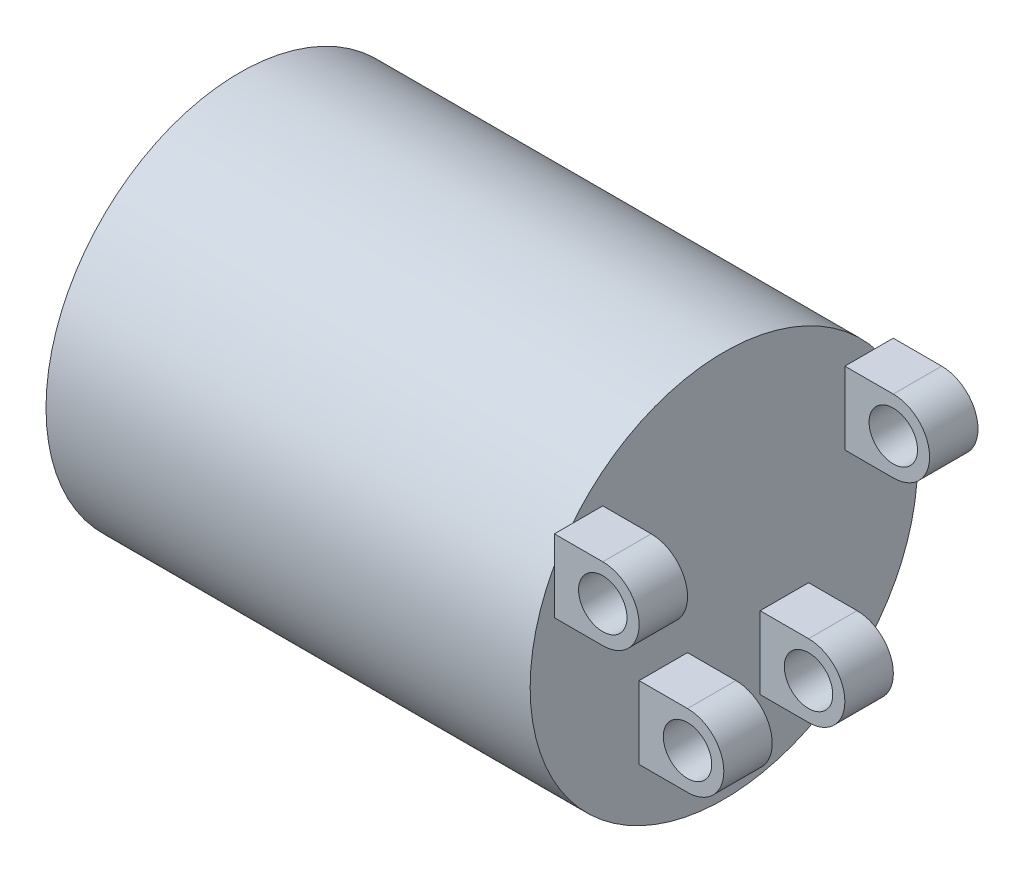
ISO-10303-21;
HEADER;
FILE_DESCRIPTION(('STEP AP214'),'2;1');
FILE_NAME('part.step','',(''),(''),'','','');
FILE_SCHEMA(('AUTOMOTIVE_DESIGN { 1 0 10303 214 1 1 1 1 }'));
ENDSEC;
DATA;
#1=APPLICATION_CONTEXT('core data for automotive mechanical design processes');
#2=APPLICATION_PROTOCOL_DEFINITION('international standard','automotive_design',2000,#1);
#3=PRODUCT_CONTEXT('',#1,'mechanical');
#4=PRODUCT('Part','Part','',(#3));
#5=PRODUCT_RELATED_PRODUCT_CATEGORY('part','',(#4));
#6=PRODUCT_DEFINITION_FORMATION('','',#4);
#7=PRODUCT_DEFINITION_CONTEXT('part definition',#1,'design');
#8=PRODUCT_DEFINITION('design','',#6,#7);
#9=PRODUCT_DEFINITION_SHAPE('','',#8);
#10=(LENGTH_UNIT() NAMED_UNIT(*) SI_UNIT(.MILLI.,.METRE.));
#11=(NAMED_UNIT(*) PLANE_ANGLE_UNIT() SI_UNIT($,.RADIAN.));
#12=(NAMED_UNIT(*) SI_UNIT($,.STERADIAN.) SOLID_ANGLE_UNIT());
#13=UNCERTAINTY_MEASURE_WITH_UNIT(LENGTH_MEASURE(1.E-05),#10,'distance_accuracy_value','');
#14=(GEOMETRIC_REPRESENTATION_CONTEXT(3) GLOBAL_UNCERTAINTY_ASSIGNED_CONTEXT((#13)) GLOBAL_UNIT_ASSIGNED_CONTEXT((#10,
#11,#12)) REPRESENTATION_CONTEXT('',''));
#15=CARTESIAN_POINT('',(0.,0.,0.));
#16=DIRECTION('',(0.,0.,1.));
#17=DIRECTION('',(1.,0.,0.));
#18=AXIS2_PLACEMENT_3D('',#15,#16,#17);
#19=CARTESIAN_POINT('',(60.,0.,-35.));
#20=DIRECTION('',(0.,0.,-1.));
#21=DIRECTION('',(-1.,0.,0.));
#22=AXIS2_PLACEMENT_3D('',#19,#20,#21);
#23=PLANE('',#22);
#24=CARTESIAN_POINT('',(60.,17.4999999999966,-35.));
#25=DIRECTION('',(0.,0.,-1.));
#26=DIRECTION('',(-1.,0.,0.));
#27=AXIS2_PLACEMENT_3D('',#24,#25,#26);
#28=CIRCLE('',#27,5.);
#29=CARTESIAN_POINT('',(55.,17.4999999999966,-35.));
#30=VERTEX_POINT('',#29);
#31=EDGE_CURVE('E210',#30,#30,#28,.T.);
#32=ORIENTED_EDGE('',*,*,#31,.F.);
#33=EDGE_LOOP('',(#32));
#34=FACE_BOUND('',#33,.T.);
#35=DIRECTION('',(-1.,0.,0.));
#36=VECTOR('',#35,1.);
#37=CARTESIAN_POINT('',(60.,25.,-35.));
#38=LINE('',#37,#36);
#39=CARTESIAN_POINT('',(60.,25.,-35.));
#40=VERTEX_POINT('',#39);
#41=CARTESIAN_POINT('',(50.,25.,-35.));
#42=VERTEX_POINT('',#41);
#43=EDGE_CURVE('E169',#40,#42,#38,.T.);
#44=ORIENTED_EDGE('',*,*,#43,.F.);
#45=CARTESIAN_POINT('',(60.,17.5,-35.));
#46=DIRECTION('',(0.,0.,1.));
#47=DIRECTION('',(1.,0.,0.));
#48=AXIS2_PLACEMENT_3D('',#45,#46,#47);
#49=CIRCLE('',#48,7.5);
#50=CARTESIAN_POINT('',(60.,10.,-35.));
#51=VERTEX_POINT('',#50);
#52=EDGE_CURVE('E200',#51,#40,#49,.T.);
#53=ORIENTED_EDGE('',*,*,#52,.F.);
#54=DIRECTION('',(-1.,0.,0.));
#55=VECTOR('',#54,1.);
#56=CARTESIAN_POINT('',(60.,10.,-35.));
#57=LINE('',#56,#55);
#58=CARTESIAN_POINT('',(50.,10.,-35.));
#59=VERTEX_POINT('',#58);
#60=EDGE_CURVE('E221',#51,#59,#57,.T.);
#61=ORIENTED_EDGE('',*,*,#60,.T.);
#62=DIRECTION('',(0.,-1.,0.));
#63=VECTOR('',#62,1.);
#64=CARTESIAN_POINT('',(50.,25.,-35.));
#65=LINE('',#64,#63);
#66=EDGE_CURVE('E13',#42,#59,#65,.T.);
#67=ORIENTED_EDGE('',*,*,#66,.F.);
#68=EDGE_LOOP('',(#44,#53,#61,#67));
#69=FACE_BOUND('',#68,.T.);
#70=ADVANCED_FACE('F150',(#34,#69),#23,.T.);
#71=CARTESIAN_POINT('',(50.,0.,0.));
#72=DIRECTION('',(1.,0.,0.));
#73=DIRECTION('',(0.,0.,-1.));
#74=AXIS2_PLACEMENT_3D('',#71,#72,#73);
#75=PLANE('',#74);
#76=DIRECTION('',(0.,0.,-1.));
#77=VECTOR('',#76,1.);
#78=CARTESIAN_POINT('',(50.,10.,0.));
#79=LINE('',#78,#77);
#80=CARTESIAN_POINT('',(50.,10.,-25.0000000000046));
#81=VERTEX_POINT('',#80);
#82=EDGE_CURVE('E214',#81,#59,#79,.T.);
#83=ORIENTED_EDGE('',*,*,#82,.F.);
#84=DIRECTION('',(0.,-1.,0.));
#85=VECTOR('',#84,1.);
#86=CARTESIAN_POINT('',(50.,24.9999999999932,-25.0000000000046));
#87=LINE('',#86,#85);
#88=CARTESIAN_POINT('',(50.,24.9999999999932,-25.0000000000046));
#89=VERTEX_POINT('',#88);
#90=EDGE_CURVE('E202',#89,#81,#87,.T.);
#91=ORIENTED_EDGE('',*,*,#90,.F.);
#92=DIRECTION('',(0.,6.82093270754391E-13,-1.));
#93=VECTOR('',#92,1.);
#94=CARTESIAN_POINT('',(50.,24.9999999999932,-25.0000000000046));
#95=LINE('',#94,#93);
#96=EDGE_CURVE('E160',#89,#42,#95,.T.);
#97=ORIENTED_EDGE('',*,*,#96,.T.);
#98=ORIENTED_EDGE('',*,*,#66,.T.);
#99=EDGE_LOOP('',(#83,#91,#97,#98));
#100=FACE_BOUND('',#99,.T.);
#101=ADVANCED_FACE('F152',(#100),#75,.F.);
#102=CARTESIAN_POINT('',(60.,0.,-25.0000000000046));
#103=DIRECTION('',(0.,0.,1.));
#104=DIRECTION('',(1.,0.,0.));
#105=AXIS2_PLACEMENT_3D('',#102,#103,#104);
#106=PLANE('',#105);
#107=CARTESIAN_POINT('',(60.,17.4999999999966,-25.0000000000046));
#108=DIRECTION('',(0.,0.,1.));
#109=DIRECTION('',(1.,0.,0.));
#110=AXIS2_PLACEMENT_3D('',#107,#108,#109);
#111=CIRCLE('',#110,5.);
#112=CARTESIAN_POINT('',(65.,17.4999999999966,-25.0000000000046));
#113=VERTEX_POINT('',#112);
#114=EDGE_CURVE('E154',#113,#113,#111,.T.);
#115=ORIENTED_EDGE('',*,*,#114,.F.);
#116=EDGE_LOOP('',(#115));
#117=FACE_BOUND('',#116,.T.);
#118=DIRECTION('',(-1.,0.,0.));
#119=VECTOR('',#118,1.);
#120=CARTESIAN_POINT('',(60.,10.,-25.0000000000046));
#121=LINE('',#120,#119);
#122=CARTESIAN_POINT('',(60.,10.0000000000068,-25.0000000000046));
#123=VERTEX_POINT('',#122);
#124=EDGE_CURVE('E209',#123,#81,#121,.T.);
#125=ORIENTED_EDGE('',*,*,#124,.F.);
#126=CARTESIAN_POINT('',(60.,17.5,-25.0000000000046));
#127=DIRECTION('',(0.,0.,1.));
#128=DIRECTION('',(1.,0.,0.));
#129=AXIS2_PLACEMENT_3D('',#126,#127,#128);
#130=CIRCLE('',#129,7.49999999999318);
#131=CARTESIAN_POINT('',(60.,24.9999999999932,-25.0000000000046));
#132=VERTEX_POINT('',#131);
#133=EDGE_CURVE('E198',#123,#132,#130,.T.);
#134=ORIENTED_EDGE('',*,*,#133,.T.);
#135=DIRECTION('',(-1.,0.,0.));
#136=VECTOR('',#135,1.);
#137=CARTESIAN_POINT('',(60.,24.9999999999932,-25.0000000000046));
#138=LINE('',#137,#136);
#139=EDGE_CURVE('E203',#132,#89,#138,.T.);
#140=ORIENTED_EDGE('',*,*,#139,.T.);
#141=ORIENTED_EDGE('',*,*,#90,.T.);
#142=EDGE_LOOP('',(#125,#134,#140,#141));
#143=FACE_BOUND('',#142,.T.);
#144=ADVANCED_FACE('F206',(#117,#143),#106,.T.);
#145=CARTESIAN_POINT('',(60.,10.,0.));
#146=DIRECTION('',(0.,1.,0.));
#147=DIRECTION('',(0.,0.,1.));
#148=AXIS2_PLACEMENT_3D('',#145,#146,#147);
#149=PLANE('',#148);
#150=ORIENTED_EDGE('',*,*,#82,.T.);
#151=ORIENTED_EDGE('',*,*,#60,.F.);
#152=DIRECTION('',(0.,0.,-1.));
#153=VECTOR('',#152,1.);
#154=CARTESIAN_POINT('',(60.,10.,0.));
#155=LINE('',#154,#153);
#156=EDGE_CURVE('E189',#123,#51,#155,.T.);
#157=ORIENTED_EDGE('',*,*,#156,.F.);
#158=ORIENTED_EDGE('',*,*,#124,.T.);
#159=EDGE_LOOP('',(#150,#151,#157,#158));
#160=FACE_BOUND('',#159,.T.);
#161=ADVANCED_FACE('F226',(#160),#149,.F.);
#162=CARTESIAN_POINT('',(60.,24.9999999999932,-25.0000000000046));
#163=DIRECTION('',(0.,1.,6.82093270754391E-13));
#164=DIRECTION('',(0.,-6.82093270754391E-13,1.));
#165=AXIS2_PLACEMENT_3D('',#162,#163,#164);
#166=PLANE('',#165);
#167=ORIENTED_EDGE('',*,*,#96,.F.);
#168=ORIENTED_EDGE('',*,*,#139,.F.);
#169=DIRECTION('',(0.,6.82093270754391E-13,-1.));
#170=VECTOR('',#169,1.);
#171=CARTESIAN_POINT('',(60.,24.9999999999932,-25.0000000000046));
#172=LINE('',#171,#170);
#173=EDGE_CURVE('E195',#132,#40,#172,.T.);
#174=ORIENTED_EDGE('',*,*,#173,.T.);
#175=ORIENTED_EDGE('',*,*,#43,.T.);
#176=EDGE_LOOP('',(#167,#168,#174,#175));
#177=FACE_BOUND('',#176,.T.);
#178=ADVANCED_FACE('F212',(#177),#166,.T.);
#179=CARTESIAN_POINT('',(60.,17.5,-25.0000000000046));
#180=DIRECTION('',(0.,0.,1.));
#181=DIRECTION('',(1.,0.,0.));
#182=AXIS2_PLACEMENT_3D('',#179,#180,#181);
#183=CYLINDRICAL_SURFACE('',#182,7.49999999999659);
#184=ORIENTED_EDGE('',*,*,#156,.T.);
#185=ORIENTED_EDGE('',*,*,#52,.T.);
#186=ORIENTED_EDGE('',*,*,#173,.F.);
#187=ORIENTED_EDGE('',*,*,#133,.F.);
#188=EDGE_LOOP('',(#184,#185,#186,#187));
#189=FACE_BOUND('',#188,.T.);
#190=ADVANCED_FACE('F197',(#189),#183,.T.);
#191=CARTESIAN_POINT('',(60.,17.4999999999966,-40.));
#192=DIRECTION('',(0.,0.,1.));
#193=DIRECTION('',(1.,0.,0.));
#194=AXIS2_PLACEMENT_3D('',#191,#192,#193);
#195=CYLINDRICAL_SURFACE('',#194,5.);
#196=ORIENTED_EDGE('',*,*,#31,.T.);
#197=EDGE_LOOP('',(#196));
#198=FACE_BOUND('',#197,.T.);
#199=ORIENTED_EDGE('',*,*,#114,.T.);
#200=EDGE_LOOP('',(#199));
#201=FACE_BOUND('',#200,.T.);
#202=ADVANCED_FACE('F246',(#198,#201),#195,.F.);
#203=CLOSED_SHELL('',(#70,#101,#144,#161,#178,#190,#202));
#204=MANIFOLD_SOLID_BREP('B2',#203);
#205=CARTESIAN_POINT('',(50.,0.,0.));
#206=DIRECTION('',(1.,0.,0.));
#207=DIRECTION('',(0.,0.,-1.));
#208=AXIS2_PLACEMENT_3D('',#205,#206,#207);
#209=PLANE('',#208);
#210=DIRECTION('',(0.,0.,1.));
#211=VECTOR('',#210,1.);
#212=CARTESIAN_POINT('',(50.,-10.,0.));
#213=LINE('',#212,#211);
#214=CARTESIAN_POINT('',(50.,-10.,7.49999999999487));
#215=VERTEX_POINT('',#214);
#216=CARTESIAN_POINT('',(50.,-10.,17.5));
#217=VERTEX_POINT('',#216);
#218=EDGE_CURVE('E378',#215,#217,#213,.T.);
#219=ORIENTED_EDGE('',*,*,#218,.F.);
#220=DIRECTION('',(0.,-1.,0.));
#221=VECTOR('',#220,1.);
#222=CARTESIAN_POINT('',(50.,-10.,7.49999999999487));
#223=LINE('',#222,#221);
#224=CARTESIAN_POINT('',(50.,-25.,7.49999999999487));
#225=VERTEX_POINT('',#224);
#226=EDGE_CURVE('E357',#215,#225,#223,.T.);
#227=ORIENTED_EDGE('',*,*,#226,.T.);
#228=DIRECTION('',(0.,0.,1.));
#229=VECTOR('',#228,1.);
#230=CARTESIAN_POINT('',(50.,-25.,7.49999999999487));
#231=LINE('',#230,#229);
#232=CARTESIAN_POINT('',(50.,-25.,17.5));
#233=VERTEX_POINT('',#232);
#234=EDGE_CURVE('E148',#225,#233,#231,.T.);
#235=ORIENTED_EDGE('',*,*,#234,.T.);
#236=DIRECTION('',(0.,-1.,0.));
#237=VECTOR('',#236,1.);
#238=CARTESIAN_POINT('',(50.,-10.,17.5));
#239=LINE('',#238,#237);
#240=EDGE_CURVE('E335',#217,#233,#239,.T.);
#241=ORIENTED_EDGE('',*,*,#240,.F.);
#242=EDGE_LOOP('',(#219,#227,#235,#241));
#243=FACE_BOUND('',#242,.T.);
#244=ADVANCED_FACE('F326',(#243),#209,.F.);
#245=CARTESIAN_POINT('',(60.,0.,7.49999999999487));
#246=DIRECTION('',(0.,0.,1.));
#247=DIRECTION('',(1.,0.,0.));
#248=AXIS2_PLACEMENT_3D('',#245,#246,#247);
#249=PLANE('',#248);
#250=CARTESIAN_POINT('',(60.,-17.5,7.49999999999487));
#251=DIRECTION('',(0.,0.,1.));
#252=DIRECTION('',(1.,0.,0.));
#253=AXIS2_PLACEMENT_3D('',#250,#251,#252);
#254=CIRCLE('',#253,5.);
#255=CARTESIAN_POINT('',(65.,-17.5,7.49999999999487));
#256=VERTEX_POINT('',#255);
#257=EDGE_CURVE('E384',#256,#256,#254,.T.);
#258=ORIENTED_EDGE('',*,*,#257,.T.);
#259=EDGE_LOOP('',(#258));
#260=FACE_BOUND('',#259,.T.);
#261=DIRECTION('',(-1.,0.,0.));
#262=VECTOR('',#261,1.);
#263=CARTESIAN_POINT('',(60.,-10.,7.49999999999487));
#264=LINE('',#263,#262);
#265=CARTESIAN_POINT('',(60.,-10.,7.49999999999487));
#266=VERTEX_POINT('',#265);
#267=EDGE_CURVE('E379',#266,#215,#264,.T.);
#268=ORIENTED_EDGE('',*,*,#267,.F.);
#269=CARTESIAN_POINT('',(60.,-17.5,7.49999999999487));
#270=DIRECTION('',(0.,0.,1.));
#271=DIRECTION('',(1.,0.,0.));
#272=AXIS2_PLACEMENT_3D('',#269,#270,#271);
#273=CIRCLE('',#272,7.5);
#274=CARTESIAN_POINT('',(60.,-25.,7.49999999999487));
#275=VERTEX_POINT('',#274);
#276=EDGE_CURVE('E375',#275,#266,#273,.T.);
#277=ORIENTED_EDGE('',*,*,#276,.F.);
#278=DIRECTION('',(-1.,0.,0.));
#279=VECTOR('',#278,1.);
#280=CARTESIAN_POINT('',(60.,-25.,7.49999999999487));
#281=LINE('',#280,#279);
#282=EDGE_CURVE('E393',#275,#225,#281,.T.);
#283=ORIENTED_EDGE('',*,*,#282,.T.);
#284=ORIENTED_EDGE('',*,*,#226,.F.);
#285=EDGE_LOOP('',(#268,#277,#283,#284));
#286=FACE_BOUND('',#285,.T.);
#287=ADVANCED_FACE('F404',(#260,#286),#249,.F.);
#288=CARTESIAN_POINT('',(60.,0.,17.5));
#289=DIRECTION('',(0.,0.,-1.));
#290=DIRECTION('',(-1.,0.,0.));
#291=AXIS2_PLACEMENT_3D('',#288,#289,#290);
#292=PLANE('',#291);
#293=CARTESIAN_POINT('',(60.,-17.5,17.5));
#294=DIRECTION('',(0.,0.,-1.));
#295=DIRECTION('',(-1.,0.,0.));
#296=AXIS2_PLACEMENT_3D('',#293,#294,#295);
#297=CIRCLE('',#296,5.);
#298=CARTESIAN_POINT('',(55.,-17.5,17.5));
#299=VERTEX_POINT('',#298);
#300=EDGE_CURVE('E329',#299,#299,#297,.T.);
#301=ORIENTED_EDGE('',*,*,#300,.T.);
#302=EDGE_LOOP('',(#301));
#303=FACE_BOUND('',#302,.T.);
#304=DIRECTION('',(-1.,0.,0.));
#305=VECTOR('',#304,1.);
#306=CARTESIAN_POINT('',(60.,-25.,17.5));
#307=LINE('',#306,#305);
#308=CARTESIAN_POINT('',(60.,-25.,17.5));
#309=VERTEX_POINT('',#308);
#310=EDGE_CURVE('E383',#309,#233,#307,.T.);
#311=ORIENTED_EDGE('',*,*,#310,.F.);
#312=CARTESIAN_POINT('',(60.,-17.5,17.5));
#313=DIRECTION('',(0.,0.,1.));
#314=DIRECTION('',(1.,0.,0.));
#315=AXIS2_PLACEMENT_3D('',#312,#313,#314);
#316=CIRCLE('',#315,7.5);
#317=CARTESIAN_POINT('',(60.,-10.,17.5));
#318=VERTEX_POINT('',#317);
#319=EDGE_CURVE('E374',#309,#318,#316,.T.);
#320=ORIENTED_EDGE('',*,*,#319,.T.);
#321=DIRECTION('',(-1.,0.,0.));
#322=VECTOR('',#321,1.);
#323=CARTESIAN_POINT('',(60.,-10.,17.5));
#324=LINE('',#323,#322);
#325=EDGE_CURVE('E381',#318,#217,#324,.T.);
#326=ORIENTED_EDGE('',*,*,#325,.T.);
#327=ORIENTED_EDGE('',*,*,#240,.T.);
#328=EDGE_LOOP('',(#311,#320,#326,#327));
#329=FACE_BOUND('',#328,.T.);
#330=ADVANCED_FACE('F380',(#303,#329),#292,.F.);
#331=CARTESIAN_POINT('',(60.,-10.,0.));
#332=DIRECTION('',(0.,-1.,0.));
#333=DIRECTION('',(0.,0.,-1.));
#334=AXIS2_PLACEMENT_3D('',#331,#332,#333);
#335=PLANE('',#334);
#336=ORIENTED_EDGE('',*,*,#218,.T.);
#337=ORIENTED_EDGE('',*,*,#325,.F.);
#338=DIRECTION('',(0.,0.,1.));
#339=VECTOR('',#338,1.);
#340=CARTESIAN_POINT('',(60.,-10.,0.));
#341=LINE('',#340,#339);
#342=EDGE_CURVE('E371',#266,#318,#341,.T.);
#343=ORIENTED_EDGE('',*,*,#342,.F.);
#344=ORIENTED_EDGE('',*,*,#267,.T.);
#345=EDGE_LOOP('',(#336,#337,#343,#344));
#346=FACE_BOUND('',#345,.T.);
#347=ADVANCED_FACE('F386',(#346),#335,.F.);
#348=CARTESIAN_POINT('',(60.,-25.,7.49999999999487));
#349=DIRECTION('',(0.,-1.,0.));
#350=DIRECTION('',(0.,0.,-1.));
#351=AXIS2_PLACEMENT_3D('',#348,#349,#350);
#352=PLANE('',#351);
#353=ORIENTED_EDGE('',*,*,#234,.F.);
#354=ORIENTED_EDGE('',*,*,#282,.F.);
#355=DIRECTION('',(0.,0.,1.));
#356=VECTOR('',#355,1.);
#357=CARTESIAN_POINT('',(60.,-25.,7.49999999999487));
#358=LINE('',#357,#356);
#359=EDGE_CURVE('E364',#275,#309,#358,.T.);
#360=ORIENTED_EDGE('',*,*,#359,.T.);
#361=ORIENTED_EDGE('',*,*,#310,.T.);
#362=EDGE_LOOP('',(#353,#354,#360,#361));
#363=FACE_BOUND('',#362,.T.);
#364=ADVANCED_FACE('F402',(#363),#352,.T.);
#365=CARTESIAN_POINT('',(60.,-17.5,17.5));
#366=DIRECTION('',(0.,0.,1.));
#367=DIRECTION('',(1.,0.,0.));
#368=AXIS2_PLACEMENT_3D('',#365,#366,#367);
#369=CYLINDRICAL_SURFACE('',#368,7.5);
#370=ORIENTED_EDGE('',*,*,#342,.T.);
#371=ORIENTED_EDGE('',*,*,#319,.F.);
#372=ORIENTED_EDGE('',*,*,#359,.F.);
#373=ORIENTED_EDGE('',*,*,#276,.T.);
#374=EDGE_LOOP('',(#370,#371,#372,#373));
#375=FACE_BOUND('',#374,.T.);
#376=ADVANCED_FACE('F373',(#375),#369,.T.);
#377=CARTESIAN_POINT('',(60.,-17.5,-40.));
#378=DIRECTION('',(0.,0.,1.));
#379=DIRECTION('',(1.,0.,0.));
#380=AXIS2_PLACEMENT_3D('',#377,#378,#379);
#381=CYLINDRICAL_SURFACE('',#380,5.);
#382=ORIENTED_EDGE('',*,*,#300,.F.);
#383=EDGE_LOOP('',(#382));
#384=FACE_BOUND('',#383,.T.);
#385=ORIENTED_EDGE('',*,*,#257,.F.);
#386=EDGE_LOOP('',(#385));
#387=FACE_BOUND('',#386,.T.);
#388=ADVANCED_FACE('F422',(#384,#387),#381,.F.);
#389=CLOSED_SHELL('',(#244,#287,#330,#347,#364,#376,#388));
#390=MANIFOLD_SOLID_BREP('B7',#389);
#391=CARTESIAN_POINT('',(50.,0.,0.));
#392=DIRECTION('',(1.,0.,0.));
#393=DIRECTION('',(0.,0.,-1.));
#394=AXIS2_PLACEMENT_3D('',#391,#392,#393);
#395=PLANE('',#394);
#396=DIRECTION('',(0.,0.,1.));
#397=VECTOR('',#396,1.);
#398=CARTESIAN_POINT('',(50.,10.,0.));
#399=LINE('',#398,#397);
#400=CARTESIAN_POINT('',(50.,10.,25.0000000000011));
#401=VERTEX_POINT('',#400);
#402=CARTESIAN_POINT('',(50.,10.,35.));
#403=VERTEX_POINT('',#402);
#404=EDGE_CURVE('E570',#401,#403,#399,.T.);
#405=ORIENTED_EDGE('',*,*,#404,.T.);
#406=DIRECTION('',(0.,-1.,0.));
#407=VECTOR('',#406,1.);
#408=CARTESIAN_POINT('',(50.,25.,35.));
#409=LINE('',#408,#407);
#410=CARTESIAN_POINT('',(50.,25.,35.));
#411=VERTEX_POINT('',#410);
#412=EDGE_CURVE('E324',#411,#403,#409,.T.);
#413=ORIENTED_EDGE('',*,*,#412,.F.);
#414=DIRECTION('',(0.,6.81746326058962E-13,1.));
#415=VECTOR('',#414,1.);
#416=CARTESIAN_POINT('',(50.,24.9999999999932,25.0000000000011));
#417=LINE('',#416,#415);
#418=CARTESIAN_POINT('',(50.,24.9999999999932,25.0000000000011));
#419=VERTEX_POINT('',#418);
#420=EDGE_CURVE('E511',#419,#411,#417,.T.);
#421=ORIENTED_EDGE('',*,*,#420,.F.);
#422=DIRECTION('',(0.,-1.,0.));
#423=VECTOR('',#422,1.);
#424=CARTESIAN_POINT('',(50.,24.9999999999932,25.0000000000011));
#425=LINE('',#424,#423);
#426=EDGE_CURVE('E558',#419,#401,#425,.T.);
#427=ORIENTED_EDGE('',*,*,#426,.T.);
#428=EDGE_LOOP('',(#405,#413,#421,#427));
#429=FACE_BOUND('',#428,.T.);
#430=ADVANCED_FACE('F502',(#429),#395,.F.);
#431=CARTESIAN_POINT('',(60.,0.,25.0000000000011));
#432=DIRECTION('',(0.,0.,1.));
#433=DIRECTION('',(1.,0.,0.));
#434=AXIS2_PLACEMENT_3D('',#431,#432,#433);
#435=PLANE('',#434);
#436=CARTESIAN_POINT('',(60.,17.4999999999966,25.0000000000011));
#437=DIRECTION('',(0.,0.,1.));
#438=DIRECTION('',(1.,0.,0.));
#439=AXIS2_PLACEMENT_3D('',#436,#437,#438);
#440=CIRCLE('',#439,5.);
#441=CARTESIAN_POINT('',(65.,17.4999999999966,25.0000000000011));
#442=VERTEX_POINT('',#441);
#443=EDGE_CURVE('E563',#442,#442,#440,.T.);
#444=ORIENTED_EDGE('',*,*,#443,.T.);
#445=EDGE_LOOP('',(#444));
#446=FACE_BOUND('',#445,.T.);
#447=DIRECTION('',(-1.,0.,0.));
#448=VECTOR('',#447,1.);
#449=CARTESIAN_POINT('',(60.,24.9999999999932,25.0000000000011));
#450=LINE('',#449,#448);
#451=CARTESIAN_POINT('',(60.,24.9999999999932,25.0000000000011));
#452=VERTEX_POINT('',#451);
#453=EDGE_CURVE('E550',#452,#419,#450,.T.);
#454=ORIENTED_EDGE('',*,*,#453,.F.);
#455=CARTESIAN_POINT('',(60.,17.4999999999966,25.0000000000011));
#456=DIRECTION('',(0.,0.,1.));
#457=DIRECTION('',(1.,0.,0.));
#458=AXIS2_PLACEMENT_3D('',#455,#456,#457);
#459=CIRCLE('',#458,7.49999999999659);
#460=CARTESIAN_POINT('',(60.,10.,25.0000000000011));
#461=VERTEX_POINT('',#460);
#462=EDGE_CURVE('E557',#461,#452,#459,.T.);
#463=ORIENTED_EDGE('',*,*,#462,.F.);
#464=DIRECTION('',(-1.,0.,0.));
#465=VECTOR('',#464,1.);
#466=CARTESIAN_POINT('',(60.,10.,25.0000000000011));
#467=LINE('',#466,#465);
#468=EDGE_CURVE('E538',#461,#401,#467,.T.);
#469=ORIENTED_EDGE('',*,*,#468,.T.);
#470=ORIENTED_EDGE('',*,*,#426,.F.);
#471=EDGE_LOOP('',(#454,#463,#469,#470));
#472=FACE_BOUND('',#471,.T.);
#473=ADVANCED_FACE('F579',(#446,#472),#435,.F.);
#474=CARTESIAN_POINT('',(60.,0.,35.));
#475=DIRECTION('',(0.,0.,-1.));
#476=DIRECTION('',(-1.,0.,0.));
#477=AXIS2_PLACEMENT_3D('',#474,#475,#476);
#478=PLANE('',#477);
#479=CARTESIAN_POINT('',(60.,17.4999999999966,35.));
#480=DIRECTION('',(0.,0.,-1.));
#481=DIRECTION('',(-1.,0.,0.));
#482=AXIS2_PLACEMENT_3D('',#479,#480,#481);
#483=CIRCLE('',#482,5.);
#484=CARTESIAN_POINT('',(55.,17.4999999999966,35.));
#485=VERTEX_POINT('',#484);
#486=EDGE_CURVE('E505',#485,#485,#483,.T.);
#487=ORIENTED_EDGE('',*,*,#486,.T.);
#488=EDGE_LOOP('',(#487));
#489=FACE_BOUND('',#488,.T.);
#490=DIRECTION('',(-1.,0.,0.));
#491=VECTOR('',#490,1.);
#492=CARTESIAN_POINT('',(60.,10.,35.));
#493=LINE('',#492,#491);
#494=CARTESIAN_POINT('',(60.,10.,35.));
#495=VERTEX_POINT('',#494);
#496=EDGE_CURVE('E562',#495,#403,#493,.T.);
#497=ORIENTED_EDGE('',*,*,#496,.F.);
#498=CARTESIAN_POINT('',(60.,17.4999999999966,35.));
#499=DIRECTION('',(0.,0.,1.));
#500=DIRECTION('',(1.,0.,0.));
#501=AXIS2_PLACEMENT_3D('',#498,#499,#500);
#502=CIRCLE('',#501,7.50000000000341);
#503=CARTESIAN_POINT('',(60.,25.,35.));
#504=VERTEX_POINT('',#503);
#505=EDGE_CURVE('E555',#495,#504,#502,.T.);
#506=ORIENTED_EDGE('',*,*,#505,.T.);
#507=DIRECTION('',(-1.,0.,0.));
#508=VECTOR('',#507,1.);
#509=CARTESIAN_POINT('',(60.,25.,35.));
#510=LINE('',#509,#508);
#511=EDGE_CURVE('E542',#504,#411,#510,.T.);
#512=ORIENTED_EDGE('',*,*,#511,.T.);
#513=ORIENTED_EDGE('',*,*,#412,.T.);
#514=EDGE_LOOP('',(#497,#506,#512,#513));
#515=FACE_BOUND('',#514,.T.);
#516=ADVANCED_FACE('F560',(#489,#515),#478,.F.);
#517=CARTESIAN_POINT('',(60.,10.,0.));
#518=DIRECTION('',(0.,-1.,0.));
#519=DIRECTION('',(0.,0.,-1.));
#520=AXIS2_PLACEMENT_3D('',#517,#518,#519);
#521=PLANE('',#520);
#522=ORIENTED_EDGE('',*,*,#404,.F.);
#523=ORIENTED_EDGE('',*,*,#468,.F.);
#524=DIRECTION('',(0.,0.,1.));
#525=VECTOR('',#524,1.);
#526=CARTESIAN_POINT('',(60.,10.,0.));
#527=LINE('',#526,#525);
#528=EDGE_CURVE('E575',#461,#495,#527,.T.);
#529=ORIENTED_EDGE('',*,*,#528,.T.);
#530=ORIENTED_EDGE('',*,*,#496,.T.);
#531=EDGE_LOOP('',(#522,#523,#529,#530));
#532=FACE_BOUND('',#531,.T.);
#533=ADVANCED_FACE('F577',(#532),#521,.T.);
#534=CARTESIAN_POINT('',(60.,24.9999999999932,25.0000000000011));
#535=DIRECTION('',(0.,-1.,6.81746326058962E-13));
#536=DIRECTION('',(0.,-6.81746326058962E-13,-1.));
#537=AXIS2_PLACEMENT_3D('',#534,#535,#536);
#538=PLANE('',#537);
#539=ORIENTED_EDGE('',*,*,#420,.T.);
#540=ORIENTED_EDGE('',*,*,#511,.F.);
#541=DIRECTION('',(0.,6.81746326058962E-13,1.));
#542=VECTOR('',#541,1.);
#543=CARTESIAN_POINT('',(60.,24.9999999999932,25.0000000000011));
#544=LINE('',#543,#542);
#545=EDGE_CURVE('E545',#452,#504,#544,.T.);
#546=ORIENTED_EDGE('',*,*,#545,.F.);
#547=ORIENTED_EDGE('',*,*,#453,.T.);
#548=EDGE_LOOP('',(#539,#540,#546,#547));
#549=FACE_BOUND('',#548,.T.);
#550=ADVANCED_FACE('F544',(#549),#538,.F.);
#551=CARTESIAN_POINT('',(60.,17.4999999999966,35.));
#552=DIRECTION('',(0.,0.,1.));
#553=DIRECTION('',(1.,0.,0.));
#554=AXIS2_PLACEMENT_3D('',#551,#552,#553);
#555=CYLINDRICAL_SURFACE('',#554,7.5);
#556=ORIENTED_EDGE('',*,*,#528,.F.);
#557=ORIENTED_EDGE('',*,*,#462,.T.);
#558=ORIENTED_EDGE('',*,*,#545,.T.);
#559=ORIENTED_EDGE('',*,*,#505,.F.);
#560=EDGE_LOOP('',(#556,#557,#558,#559));
#561=FACE_BOUND('',#560,.T.);
#562=ADVANCED_FACE('F554',(#561),#555,.T.);
#563=CARTESIAN_POINT('',(60.,17.4999999999966,-40.));
#564=DIRECTION('',(0.,0.,1.));
#565=DIRECTION('',(1.,0.,0.));
#566=AXIS2_PLACEMENT_3D('',#563,#564,#565);
#567=CYLINDRICAL_SURFACE('',#566,5.);
#568=ORIENTED_EDGE('',*,*,#486,.F.);
#569=EDGE_LOOP('',(#568));
#570=FACE_BOUND('',#569,.T.);
#571=ORIENTED_EDGE('',*,*,#443,.F.);
#572=EDGE_LOOP('',(#571));
#573=FACE_BOUND('',#572,.T.);
#574=ADVANCED_FACE('F600',(#570,#573),#567,.F.);
#575=CLOSED_SHELL('',(#430,#473,#516,#533,#550,#562,#574));
#576=MANIFOLD_SOLID_BREP('B142',#575);
#577=CARTESIAN_POINT('',(60.,0.,-17.5185281486623));
#578=DIRECTION('',(0.,0.,-1.));
#579=DIRECTION('',(0.,1.,0.));
#580=AXIS2_PLACEMENT_3D('',#577,#578,#579);
#581=PLANE('',#580);
#582=CARTESIAN_POINT('',(60.,-17.5,-17.5185281486623));
#583=DIRECTION('',(0.,0.,-1.));
#584=DIRECTION('',(0.,1.,0.));
#585=AXIS2_PLACEMENT_3D('',#582,#583,#584);
#586=CIRCLE('',#585,5.);
#587=CARTESIAN_POINT('',(60.,-12.5,-17.5185281486623));
#588=VERTEX_POINT('',#587);
#589=EDGE_CURVE('E737',#588,#588,#586,.T.);
#590=ORIENTED_EDGE('',*,*,#589,.F.);
#591=EDGE_LOOP('',(#590));
#592=FACE_BOUND('',#591,.T.);
#593=DIRECTION('',(-1.,0.,0.));
#594=VECTOR('',#593,1.);
#595=CARTESIAN_POINT('',(60.,-10.,-17.5185281486623));
#596=LINE('',#595,#594);
#597=CARTESIAN_POINT('',(60.,-10.,-17.5185281486623));
#598=VERTEX_POINT('',#597);
#599=CARTESIAN_POINT('',(50.,-10.,-17.5185281486623));
#600=VERTEX_POINT('',#599);
#601=EDGE_CURVE('E500',#598,#600,#596,.T.);
#602=ORIENTED_EDGE('',*,*,#601,.F.);
#603=CARTESIAN_POINT('',(60.,-17.5,-17.5185281486623));
#604=DIRECTION('',(0.,0.,1.));
#605=DIRECTION('',(1.,0.,0.));
#606=AXIS2_PLACEMENT_3D('',#603,#604,#605);
#607=CIRCLE('',#606,7.5);
#608=CARTESIAN_POINT('',(60.,-25.,-17.5185281486623));
#609=VERTEX_POINT('',#608);
#610=EDGE_CURVE('E731',#609,#598,#607,.T.);
#611=ORIENTED_EDGE('',*,*,#610,.F.);
#612=DIRECTION('',(-1.,0.,0.));
#613=VECTOR('',#612,1.);
#614=CARTESIAN_POINT('',(60.,-25.,-17.5185281486623));
#615=LINE('',#614,#613);
#616=CARTESIAN_POINT('',(50.,-25.,-17.5185281486623));
#617=VERTEX_POINT('',#616);
#618=EDGE_CURVE('E719',#609,#617,#615,.T.);
#619=ORIENTED_EDGE('',*,*,#618,.T.);
#620=DIRECTION('',(0.,-1.,0.));
#621=VECTOR('',#620,1.);
#622=CARTESIAN_POINT('',(50.,0.,-17.5185281486623));
#623=LINE('',#622,#621);
#624=EDGE_CURVE('E712',#600,#617,#623,.T.);
#625=ORIENTED_EDGE('',*,*,#624,.F.);
#626=EDGE_LOOP('',(#602,#611,#619,#625));
#627=FACE_BOUND('',#626,.T.);
#628=ADVANCED_FACE('F675',(#592,#627),#581,.T.);
#629=CARTESIAN_POINT('',(50.,0.,0.));
#630=DIRECTION('',(1.,0.,0.));
#631=DIRECTION('',(0.,0.,-1.));
#632=AXIS2_PLACEMENT_3D('',#629,#630,#631);
#633=PLANE('',#632);
#634=ORIENTED_EDGE('',*,*,#624,.T.);
#635=DIRECTION('',(0.,0.,-1.));
#636=VECTOR('',#635,1.);
#637=CARTESIAN_POINT('',(50.,-25.,-7.4999999999983));
#638=LINE('',#637,#636);
#639=CARTESIAN_POINT('',(50.,-25.,-7.4999999999983));
#640=VERTEX_POINT('',#639);
#641=EDGE_CURVE('E724',#640,#617,#638,.T.);
#642=ORIENTED_EDGE('',*,*,#641,.F.);
#643=DIRECTION('',(0.,1.,0.));
#644=VECTOR('',#643,1.);
#645=CARTESIAN_POINT('',(50.,0.,-7.4999999999983));
#646=LINE('',#645,#644);
#647=CARTESIAN_POINT('',(50.,-10.,-7.4999999999983));
#648=VERTEX_POINT('',#647);
#649=EDGE_CURVE('E743',#640,#648,#646,.T.);
#650=ORIENTED_EDGE('',*,*,#649,.T.);
#651=DIRECTION('',(0.,0.,-1.));
#652=VECTOR('',#651,1.);
#653=CARTESIAN_POINT('',(50.,-10.,0.));
#654=LINE('',#653,#652);
#655=EDGE_CURVE('E745',#648,#600,#654,.T.);
#656=ORIENTED_EDGE('',*,*,#655,.T.);
#657=EDGE_LOOP('',(#634,#642,#650,#656));
#658=FACE_BOUND('',#657,.T.);
#659=ADVANCED_FACE('F751',(#658),#633,.F.);
#660=CARTESIAN_POINT('',(60.,0.,-7.4999999999983));
#661=DIRECTION('',(0.,0.,1.));
#662=DIRECTION('',(1.,0.,0.));
#663=AXIS2_PLACEMENT_3D('',#660,#661,#662);
#664=PLANE('',#663);
#665=CARTESIAN_POINT('',(60.,-17.5,-7.49999999999831));
#666=DIRECTION('',(0.,0.,1.));
#667=DIRECTION('',(1.,0.,0.));
#668=AXIS2_PLACEMENT_3D('',#665,#666,#667);
#669=CIRCLE('',#668,5.);
#670=CARTESIAN_POINT('',(65.,-17.5,-7.49999999999831));
#671=VERTEX_POINT('',#670);
#672=EDGE_CURVE('E679',#671,#671,#669,.T.);
#673=ORIENTED_EDGE('',*,*,#672,.F.);
#674=EDGE_LOOP('',(#673));
#675=FACE_BOUND('',#674,.T.);
#676=DIRECTION('',(-1.,0.,0.));
#677=VECTOR('',#676,1.);
#678=CARTESIAN_POINT('',(60.,-25.,-7.4999999999983));
#679=LINE('',#678,#677);
#680=CARTESIAN_POINT('',(60.,-25.,-7.4999999999983));
#681=VERTEX_POINT('',#680);
#682=EDGE_CURVE('E727',#681,#640,#679,.T.);
#683=ORIENTED_EDGE('',*,*,#682,.F.);
#684=CARTESIAN_POINT('',(60.,-17.5,-7.4999999999983));
#685=DIRECTION('',(0.,0.,1.));
#686=DIRECTION('',(1.,0.,0.));
#687=AXIS2_PLACEMENT_3D('',#684,#685,#686);
#688=CIRCLE('',#687,7.5);
#689=CARTESIAN_POINT('',(60.,-10.,-7.4999999999983));
#690=VERTEX_POINT('',#689);
#691=EDGE_CURVE('E733',#681,#690,#688,.T.);
#692=ORIENTED_EDGE('',*,*,#691,.T.);
#693=DIRECTION('',(-1.,0.,0.));
#694=VECTOR('',#693,1.);
#695=CARTESIAN_POINT('',(60.,-10.,-7.4999999999983));
#696=LINE('',#695,#694);
#697=EDGE_CURVE('E685',#690,#648,#696,.T.);
#698=ORIENTED_EDGE('',*,*,#697,.T.);
#699=ORIENTED_EDGE('',*,*,#649,.F.);
#700=EDGE_LOOP('',(#683,#692,#698,#699));
#701=FACE_BOUND('',#700,.T.);
#702=ADVANCED_FACE('F752',(#675,#701),#664,.T.);
#703=CARTESIAN_POINT('',(60.,-10.,0.));
#704=DIRECTION('',(0.,1.,0.));
#705=DIRECTION('',(0.,0.,1.));
#706=AXIS2_PLACEMENT_3D('',#703,#704,#705);
#707=PLANE('',#706);
#708=ORIENTED_EDGE('',*,*,#655,.F.);
#709=ORIENTED_EDGE('',*,*,#697,.F.);
#710=DIRECTION('',(0.,0.,-1.));
#711=VECTOR('',#710,1.);
#712=CARTESIAN_POINT('',(60.,-10.,0.));
#713=LINE('',#712,#711);
#714=EDGE_CURVE('E741',#690,#598,#713,.T.);
#715=ORIENTED_EDGE('',*,*,#714,.T.);
#716=ORIENTED_EDGE('',*,*,#601,.T.);
#717=EDGE_LOOP('',(#708,#709,#715,#716));
#718=FACE_BOUND('',#717,.T.);
#719=ADVANCED_FACE('F753',(#718),#707,.T.);
#720=CARTESIAN_POINT('',(60.,-25.,-7.4999999999983));
#721=DIRECTION('',(0.,1.,0.));
#722=DIRECTION('',(0.,0.,1.));
#723=AXIS2_PLACEMENT_3D('',#720,#721,#722);
#724=PLANE('',#723);
#725=ORIENTED_EDGE('',*,*,#641,.T.);
#726=ORIENTED_EDGE('',*,*,#618,.F.);
#727=DIRECTION('',(0.,0.,-1.));
#728=VECTOR('',#727,1.);
#729=CARTESIAN_POINT('',(60.,-25.,-7.4999999999983));
#730=LINE('',#729,#728);
#731=EDGE_CURVE('E722',#681,#609,#730,.T.);
#732=ORIENTED_EDGE('',*,*,#731,.F.);
#733=ORIENTED_EDGE('',*,*,#682,.T.);
#734=EDGE_LOOP('',(#725,#726,#732,#733));
#735=FACE_BOUND('',#734,.T.);
#736=ADVANCED_FACE('F677',(#735),#724,.F.);
#737=CARTESIAN_POINT('',(60.,-17.5,-7.4999999999983));
#738=DIRECTION('',(0.,0.,1.));
#739=DIRECTION('',(1.,0.,0.));
#740=AXIS2_PLACEMENT_3D('',#737,#738,#739);
#741=CYLINDRICAL_SURFACE('',#740,7.5);
#742=ORIENTED_EDGE('',*,*,#714,.F.);
#743=ORIENTED_EDGE('',*,*,#691,.F.);
#744=ORIENTED_EDGE('',*,*,#731,.T.);
#745=ORIENTED_EDGE('',*,*,#610,.T.);
#746=EDGE_LOOP('',(#742,#743,#744,#745));
#747=FACE_BOUND('',#746,.T.);
#748=ADVANCED_FACE('F730',(#747),#741,.T.);
#749=CARTESIAN_POINT('',(60.,-17.5,-40.));
#750=DIRECTION('',(0.,0.,1.));
#751=DIRECTION('',(1.,0.,0.));
#752=AXIS2_PLACEMENT_3D('',#749,#750,#751);
#753=CYLINDRICAL_SURFACE('',#752,5.);
#754=ORIENTED_EDGE('',*,*,#589,.T.);
#755=EDGE_LOOP('',(#754));
#756=FACE_BOUND('',#755,.T.);
#757=ORIENTED_EDGE('',*,*,#672,.T.);
#758=EDGE_LOOP('',(#757));
#759=FACE_BOUND('',#758,.T.);
#760=ADVANCED_FACE('F771',(#756,#759),#753,.F.);
#761=CLOSED_SHELL('',(#628,#659,#702,#719,#736,#748,#760));
#762=MANIFOLD_SOLID_BREP('B318',#761);
#763=CARTESIAN_POINT('',(50.,0.,0.));
#764=DIRECTION('',(-1.,0.,0.));
#765=DIRECTION('',(0.,0.,1.));
#766=AXIS2_PLACEMENT_3D('',#763,#764,#765);
#767=CYLINDRICAL_SURFACE('',#766,40.);
#768=CARTESIAN_POINT('',(50.,0.,0.));
#769=DIRECTION('',(1.,0.,0.));
#770=DIRECTION('',(0.,0.,-1.));
#771=AXIS2_PLACEMENT_3D('',#768,#769,#770);
#772=CIRCLE('',#771,40.);
#773=CARTESIAN_POINT('',(50.,0.,-40.));
#774=VERTEX_POINT('',#773);
#775=EDGE_CURVE('E674',#774,#774,#772,.T.);
#776=ORIENTED_EDGE('',*,*,#775,.F.);
#777=EDGE_LOOP('',(#776));
#778=FACE_BOUND('',#777,.T.);
#779=CARTESIAN_POINT('',(-50.,0.,0.));
#780=DIRECTION('',(1.,0.,0.));
#781=DIRECTION('',(0.,0.,-1.));
#782=AXIS2_PLACEMENT_3D('',#779,#780,#781);
#783=CIRCLE('',#782,40.);
#784=CARTESIAN_POINT('',(-50.,0.,-40.));
#785=VERTEX_POINT('',#784);
#786=EDGE_CURVE('E847',#785,#785,#783,.T.);
#787=ORIENTED_EDGE('',*,*,#786,.T.);
#788=EDGE_LOOP('',(#787));
#789=FACE_BOUND('',#788,.T.);
#790=ADVANCED_FACE('F840',(#778,#789),#767,.T.);
#791=CARTESIAN_POINT('',(50.,0.,0.));
#792=DIRECTION('',(1.,0.,0.));
#793=DIRECTION('',(0.,0.,-1.));
#794=AXIS2_PLACEMENT_3D('',#791,#792,#793);
#795=PLANE('',#794);
#796=ORIENTED_EDGE('',*,*,#775,.T.);
#797=EDGE_LOOP('',(#796));
#798=FACE_BOUND('',#797,.T.);
#799=ADVANCED_FACE('F857',(#798),#795,.T.);
#800=CARTESIAN_POINT('',(-50.,0.,0.));
#801=DIRECTION('',(1.,0.,0.));
#802=DIRECTION('',(0.,0.,-1.));
#803=AXIS2_PLACEMENT_3D('',#800,#801,#802);
#804=PLANE('',#803);
#805=ORIENTED_EDGE('',*,*,#786,.F.);
#806=EDGE_LOOP('',(#805));
#807=FACE_BOUND('',#806,.T.);
#808=ADVANCED_FACE('F855',(#807),#804,.F.);
#809=CLOSED_SHELL('',(#790,#799,#808));
#810=MANIFOLD_SOLID_BREP('B494',#809);
#811=ADVANCED_BREP_SHAPE_REPRESENTATION('',(#18,#204,#390,#576,#762,#810),#14);
#812=SHAPE_DEFINITION_REPRESENTATION(#9,#811);
ENDSEC;
END-ISO-10303-21;
